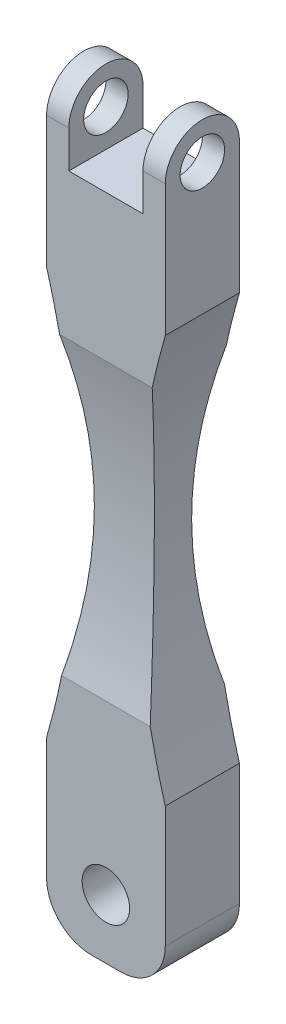
ISO-10303-21;
HEADER;
FILE_DESCRIPTION(('STEP AP214'),'2;1');
FILE_NAME('part.step','',(''),(''),'','','');
FILE_SCHEMA(('AUTOMOTIVE_DESIGN { 1 0 10303 214 1 1 1 1 }'));
ENDSEC;
DATA;
#1=APPLICATION_CONTEXT('core data for automotive mechanical design processes');
#2=APPLICATION_PROTOCOL_DEFINITION('international standard','automotive_design',2000,#1);
#3=PRODUCT_CONTEXT('',#1,'mechanical');
#4=PRODUCT('Part','Part','',(#3));
#5=PRODUCT_RELATED_PRODUCT_CATEGORY('part','',(#4));
#6=PRODUCT_DEFINITION_FORMATION('','',#4);
#7=PRODUCT_DEFINITION_CONTEXT('part definition',#1,'design');
#8=PRODUCT_DEFINITION('design','',#6,#7);
#9=PRODUCT_DEFINITION_SHAPE('','',#8);
#10=(LENGTH_UNIT() NAMED_UNIT(*) SI_UNIT(.MILLI.,.METRE.));
#11=(NAMED_UNIT(*) PLANE_ANGLE_UNIT() SI_UNIT($,.RADIAN.));
#12=(NAMED_UNIT(*) SI_UNIT($,.STERADIAN.) SOLID_ANGLE_UNIT());
#13=UNCERTAINTY_MEASURE_WITH_UNIT(LENGTH_MEASURE(1.E-05),#10,'distance_accuracy_value','');
#14=(GEOMETRIC_REPRESENTATION_CONTEXT(3) GLOBAL_UNCERTAINTY_ASSIGNED_CONTEXT((#13)) GLOBAL_UNIT_ASSIGNED_CONTEXT((#10,
#11,#12)) REPRESENTATION_CONTEXT('',''));
#15=CARTESIAN_POINT('',(0.,0.,0.));
#16=DIRECTION('',(0.,0.,1.));
#17=DIRECTION('',(1.,0.,0.));
#18=AXIS2_PLACEMENT_3D('',#15,#16,#17);
#19=CARTESIAN_POINT('',(4.,-22.,5.));
#20=DIRECTION('',(-1.,0.,0.));
#21=DIRECTION('',(0.,0.,1.));
#22=AXIS2_PLACEMENT_3D('',#19,#20,#21);
#23=PLANE('',#22);
#24=CARTESIAN_POINT('',(4.,22.5,2.5));
#25=DIRECTION('',(1.,0.,0.));
#26=DIRECTION('',(0.,0.,-1.));
#27=AXIS2_PLACEMENT_3D('',#24,#25,#26);
#28=CIRCLE('',#27,1.5);
#29=CARTESIAN_POINT('',(4.,22.5,1.));
#30=VERTEX_POINT('',#29);
#31=EDGE_CURVE('E253',#30,#30,#28,.T.);
#32=ORIENTED_EDGE('',*,*,#31,.F.);
#33=EDGE_LOOP('',(#32));
#34=FACE_BOUND('',#33,.T.);
#35=DIRECTION('',(0.,1.,0.));
#36=VECTOR('',#35,1.);
#37=CARTESIAN_POINT('',(4.,-22.,5.));
#38=LINE('',#37,#36);
#39=CARTESIAN_POINT('',(4.00000000002386,13.6424052445208,5.));
#40=VERTEX_POINT('',#39);
#41=CARTESIAN_POINT('',(4.,22.5,5.));
#42=VERTEX_POINT('',#41);
#43=EDGE_CURVE('E177',#40,#42,#38,.T.);
#44=ORIENTED_EDGE('',*,*,#43,.F.);
#45=DIRECTION('',(0.,0.,1.));
#46=VECTOR('',#45,1.);
#47=CARTESIAN_POINT('',(4.,13.6424052444381,-6.));
#48=LINE('',#47,#46);
#49=CARTESIAN_POINT('',(4.00000000002386,13.6424052445208,0.));
#50=VERTEX_POINT('',#49);
#51=EDGE_CURVE('E160',#40,#50,#48,.F.);
#52=ORIENTED_EDGE('',*,*,#51,.T.);
#53=DIRECTION('',(0.,1.,0.));
#54=VECTOR('',#53,1.);
#55=CARTESIAN_POINT('',(4.,-22.,0.));
#56=LINE('',#55,#54);
#57=CARTESIAN_POINT('',(4.,22.5,0.));
#58=VERTEX_POINT('',#57);
#59=EDGE_CURVE('E212',#50,#58,#56,.T.);
#60=ORIENTED_EDGE('',*,*,#59,.T.);
#61=CARTESIAN_POINT('',(4.,22.5,2.5));
#62=DIRECTION('',(-1.,0.,0.));
#63=DIRECTION('',(0.,0.,1.));
#64=AXIS2_PLACEMENT_3D('',#61,#62,#63);
#65=CIRCLE('',#64,2.5);
#66=EDGE_CURVE('E185',#58,#42,#65,.F.);
#67=ORIENTED_EDGE('',*,*,#66,.T.);
#68=EDGE_LOOP('',(#44,#52,#60,#67));
#69=FACE_BOUND('',#68,.T.);
#70=ADVANCED_FACE('F32',(#34,#69),#23,.F.);
#71=CARTESIAN_POINT('',(-4.,-22.,5.));
#72=DIRECTION('',(1.,0.,0.));
#73=DIRECTION('',(0.,0.,-1.));
#74=AXIS2_PLACEMENT_3D('',#71,#72,#73);
#75=PLANE('',#74);
#76=DIRECTION('',(0.,-1.,0.));
#77=VECTOR('',#76,1.);
#78=CARTESIAN_POINT('',(-4.,-22.,5.));
#79=LINE('',#78,#77);
#80=CARTESIAN_POINT('',(-3.9999999999869,-13.8172930789792,5.));
#81=VERTEX_POINT('',#80);
#82=CARTESIAN_POINT('',(-4.,-22.,5.));
#83=VERTEX_POINT('',#82);
#84=EDGE_CURVE('E191',#81,#83,#79,.T.);
#85=ORIENTED_EDGE('',*,*,#84,.F.);
#86=DIRECTION('',(0.,0.,1.));
#87=VECTOR('',#86,1.);
#88=CARTESIAN_POINT('',(-4.,-13.8172930790245,-6.));
#89=LINE('',#88,#87);
#90=CARTESIAN_POINT('',(-3.9999999999869,-13.8172930789792,0.));
#91=VERTEX_POINT('',#90);
#92=EDGE_CURVE('E304',#81,#91,#89,.F.);
#93=ORIENTED_EDGE('',*,*,#92,.T.);
#94=DIRECTION('',(0.,-1.,0.));
#95=VECTOR('',#94,1.);
#96=CARTESIAN_POINT('',(-4.,-22.,0.));
#97=LINE('',#96,#95);
#98=CARTESIAN_POINT('',(-4.,-22.,0.));
#99=VERTEX_POINT('',#98);
#100=EDGE_CURVE('E211',#91,#99,#97,.T.);
#101=ORIENTED_EDGE('',*,*,#100,.T.);
#102=DIRECTION('',(0.,0.,-1.));
#103=VECTOR('',#102,1.);
#104=CARTESIAN_POINT('',(-4.,-22.,5.));
#105=LINE('',#104,#103);
#106=EDGE_CURVE('E227',#83,#99,#105,.T.);
#107=ORIENTED_EDGE('',*,*,#106,.F.);
#108=EDGE_LOOP('',(#85,#93,#101,#107));
#109=FACE_BOUND('',#108,.T.);
#110=ADVANCED_FACE('F388',(#109),#75,.F.);
#111=CARTESIAN_POINT('',(-1.,-22.,0.));
#112=DIRECTION('',(0.,0.,-1.));
#113=DIRECTION('',(-1.,0.,0.));
#114=AXIS2_PLACEMENT_3D('',#111,#112,#113);
#115=PLANE('',#114);
#116=CARTESIAN_POINT('',(4.94369397898697,16.5966869294563,0.));
#117=CARTESIAN_POINT('',(-1.05582625880514,-0.525578169850888,0.));
#118=CARTESIAN_POINT('',(5.2463691205576,-17.605604068025,0.));
#119=B_SPLINE_CURVE_WITH_KNOTS('',2,(#116,#117,#118),.UNSPECIFIED.,.F.,.F.,(3,3),(0.,1.),.UNSPECIFIED.);
#120=CARTESIAN_POINT('',(3.12090452014877,10.1520270472682,2.16682683081004E-11));
#121=VERTEX_POINT('',#120);
#122=EDGE_CURVE('E166',#121,#50,#119,.F.);
#123=ORIENTED_EDGE('',*,*,#122,.F.);
#124=DIRECTION('',(1.,0.,0.));
#125=VECTOR('',#124,1.);
#126=CARTESIAN_POINT('',(-7.,10.1520270473549,0.));
#127=LINE('',#126,#125);
#128=CARTESIAN_POINT('',(-3.12090452014877,10.1520270473549,0.));
#129=VERTEX_POINT('',#128);
#130=EDGE_CURVE('E331',#129,#121,#127,.T.);
#131=ORIENTED_EDGE('',*,*,#130,.F.);
#132=CARTESIAN_POINT('',(-5.24636912055759,-17.605604068025,0.));
#133=CARTESIAN_POINT('',(1.05582625880514,-0.525578169850889,0.));
#134=CARTESIAN_POINT('',(-4.94369397898697,16.5966869294563,0.));
#135=B_SPLINE_CURVE_WITH_KNOTS('',2,(#132,#133,#134),.UNSPECIFIED.,.F.,.F.,(3,3),(0.,1.),.UNSPECIFIED.);
#136=CARTESIAN_POINT('',(-4.00000000002386,13.6424052445208,0.));
#137=VERTEX_POINT('',#136);
#138=EDGE_CURVE('E59',#137,#129,#135,.F.);
#139=ORIENTED_EDGE('',*,*,#138,.F.);
#140=CARTESIAN_POINT('',(-4.,22.5,0.));
#141=VERTEX_POINT('',#140);
#142=EDGE_CURVE('E213',#141,#137,#97,.T.);
#143=ORIENTED_EDGE('',*,*,#142,.F.);
#144=DIRECTION('',(1.,0.,0.));
#145=VECTOR('',#144,1.);
#146=CARTESIAN_POINT('',(-2.5,22.5,0.));
#147=LINE('',#146,#145);
#148=CARTESIAN_POINT('',(-2.5,22.5,0.));
#149=VERTEX_POINT('',#148);
#150=EDGE_CURVE('E235',#141,#149,#147,.T.);
#151=ORIENTED_EDGE('',*,*,#150,.T.);
#152=DIRECTION('',(0.,1.,0.));
#153=VECTOR('',#152,1.);
#154=CARTESIAN_POINT('',(-2.49999999999999,-22.,0.));
#155=LINE('',#154,#153);
#156=CARTESIAN_POINT('',(-2.5,20.,0.));
#157=VERTEX_POINT('',#156);
#158=EDGE_CURVE('E360',#157,#149,#155,.T.);
#159=ORIENTED_EDGE('',*,*,#158,.F.);
#160=DIRECTION('',(-1.,0.,0.));
#161=VECTOR('',#160,1.);
#162=CARTESIAN_POINT('',(-1.,20.,0.));
#163=LINE('',#162,#161);
#164=CARTESIAN_POINT('',(2.5,20.,0.));
#165=VERTEX_POINT('',#164);
#166=EDGE_CURVE('E230',#165,#157,#163,.T.);
#167=ORIENTED_EDGE('',*,*,#166,.F.);
#168=DIRECTION('',(0.,-1.,0.));
#169=VECTOR('',#168,1.);
#170=CARTESIAN_POINT('',(2.5,-22.,0.));
#171=LINE('',#170,#169);
#172=CARTESIAN_POINT('',(2.5,22.5,0.));
#173=VERTEX_POINT('',#172);
#174=EDGE_CURVE('E356',#173,#165,#171,.T.);
#175=ORIENTED_EDGE('',*,*,#174,.F.);
#176=DIRECTION('',(1.,0.,0.));
#177=VECTOR('',#176,1.);
#178=CARTESIAN_POINT('',(2.5,22.5,0.));
#179=LINE('',#178,#177);
#180=EDGE_CURVE('E242',#173,#58,#179,.T.);
#181=ORIENTED_EDGE('',*,*,#180,.T.);
#182=ORIENTED_EDGE('',*,*,#59,.F.);
#183=EDGE_LOOP('',(#123,#131,#139,#143,#151,#159,#167,#175,#181,#182));
#184=FACE_BOUND('',#183,.T.);
#185=ADVANCED_FACE('F395',(#184),#115,.T.);
#186=CARTESIAN_POINT('',(-1.,-22.,5.));
#187=DIRECTION('',(0.,0.,-1.));
#188=DIRECTION('',(-1.,0.,0.));
#189=AXIS2_PLACEMENT_3D('',#186,#187,#188);
#190=PLANE('',#189);
#191=CARTESIAN_POINT('',(0.,-21.,5.));
#192=DIRECTION('',(0.,0.,1.));
#193=DIRECTION('',(1.,0.,0.));
#194=AXIS2_PLACEMENT_3D('',#191,#192,#193);
#195=CIRCLE('',#194,1.6);
#196=CARTESIAN_POINT('',(1.6,-21.,5.));
#197=VERTEX_POINT('',#196);
#198=EDGE_CURVE('E362',#197,#197,#195,.T.);
#199=ORIENTED_EDGE('',*,*,#198,.F.);
#200=EDGE_LOOP('',(#199));
#201=FACE_BOUND('',#200,.T.);
#202=CARTESIAN_POINT('',(4.,-22.,5.));
#203=VERTEX_POINT('',#202);
#204=CARTESIAN_POINT('',(3.9999999999869,-13.8172930789791,5.));
#205=VERTEX_POINT('',#204);
#206=EDGE_CURVE('E187',#203,#205,#38,.T.);
#207=ORIENTED_EDGE('',*,*,#206,.T.);
#208=CARTESIAN_POINT('',(4.94369397898697,16.5966869294563,5.));
#209=CARTESIAN_POINT('',(-1.05582625880514,-0.525578169850888,5.));
#210=CARTESIAN_POINT('',(5.2463691205576,-17.605604068025,5.));
#211=B_SPLINE_CURVE_WITH_KNOTS('',2,(#208,#209,#210),.UNSPECIFIED.,.F.,.F.,(3,3),(0.,1.),.UNSPECIFIED.);
#212=CARTESIAN_POINT('',(2.98651646666856,-9.6892863226698,5.));
#213=VERTEX_POINT('',#212);
#214=EDGE_CURVE('E182',#213,#205,#211,.T.);
#215=ORIENTED_EDGE('',*,*,#214,.F.);
#216=DIRECTION('',(1.,0.,0.));
#217=VECTOR('',#216,1.);
#218=CARTESIAN_POINT('',(-7.,-9.68928632245198,5.));
#219=LINE('',#218,#217);
#220=CARTESIAN_POINT('',(-2.98651646666856,-9.6892863226698,5.));
#221=VERTEX_POINT('',#220);
#222=EDGE_CURVE('E336',#213,#221,#219,.F.);
#223=ORIENTED_EDGE('',*,*,#222,.T.);
#224=CARTESIAN_POINT('',(-5.24636912055759,-17.605604068025,5.));
#225=CARTESIAN_POINT('',(1.05582625880514,-0.525578169850889,5.));
#226=CARTESIAN_POINT('',(-4.94369397898697,16.5966869294563,5.));
#227=B_SPLINE_CURVE_WITH_KNOTS('',2,(#224,#225,#226),.UNSPECIFIED.,.F.,.F.,(3,3),(0.,1.),.UNSPECIFIED.);
#228=EDGE_CURVE('E284',#81,#221,#227,.T.);
#229=ORIENTED_EDGE('',*,*,#228,.F.);
#230=ORIENTED_EDGE('',*,*,#84,.T.);
#231=CARTESIAN_POINT('',(-1.,-22.,5.));
#232=DIRECTION('',(0.,0.,1.));
#233=DIRECTION('',(-1.,0.,0.));
#234=AXIS2_PLACEMENT_3D('',#231,#232,#233);
#235=CIRCLE('',#234,3.);
#236=CARTESIAN_POINT('',(-0.999999999999999,-25.,5.));
#237=VERTEX_POINT('',#236);
#238=EDGE_CURVE('E201',#83,#237,#235,.T.);
#239=ORIENTED_EDGE('',*,*,#238,.T.);
#240=DIRECTION('',(1.,0.,0.));
#241=VECTOR('',#240,1.);
#242=CARTESIAN_POINT('',(-1.,-25.,5.));
#243=LINE('',#242,#241);
#244=CARTESIAN_POINT('',(1.,-25.,5.));
#245=VERTEX_POINT('',#244);
#246=EDGE_CURVE('E203',#237,#245,#243,.T.);
#247=ORIENTED_EDGE('',*,*,#246,.T.);
#248=CARTESIAN_POINT('',(1.,-22.,5.));
#249=DIRECTION('',(0.,0.,1.));
#250=DIRECTION('',(1.,0.,0.));
#251=AXIS2_PLACEMENT_3D('',#248,#249,#250);
#252=CIRCLE('',#251,3.);
#253=EDGE_CURVE('E205',#245,#203,#252,.T.);
#254=ORIENTED_EDGE('',*,*,#253,.T.);
#255=EDGE_LOOP('',(#207,#215,#223,#229,#230,#239,#247,#254));
#256=FACE_BOUND('',#255,.T.);
#257=ADVANCED_FACE('F445',(#201,#256),#190,.F.);
#258=CARTESIAN_POINT('',(2.5,22.5,2.5));
#259=DIRECTION('',(-1.,0.,0.));
#260=DIRECTION('',(0.,0.,1.));
#261=AXIS2_PLACEMENT_3D('',#258,#259,#260);
#262=CYLINDRICAL_SURFACE('',#261,2.5);
#263=ORIENTED_EDGE('',*,*,#180,.F.);
#264=CARTESIAN_POINT('',(2.5,22.5,2.5));
#265=DIRECTION('',(1.,0.,0.));
#266=DIRECTION('',(0.,1.,0.));
#267=AXIS2_PLACEMENT_3D('',#264,#265,#266);
#268=CIRCLE('',#267,2.5);
#269=CARTESIAN_POINT('',(2.5,22.5,5.));
#270=VERTEX_POINT('',#269);
#271=EDGE_CURVE('E247',#270,#173,#268,.F.);
#272=ORIENTED_EDGE('',*,*,#271,.F.);
#273=DIRECTION('',(-1.,0.,0.));
#274=VECTOR('',#273,1.);
#275=CARTESIAN_POINT('',(-1.,22.5,5.));
#276=LINE('',#275,#274);
#277=EDGE_CURVE('E245',#42,#270,#276,.T.);
#278=ORIENTED_EDGE('',*,*,#277,.F.);
#279=ORIENTED_EDGE('',*,*,#66,.F.);
#280=EDGE_LOOP('',(#263,#272,#278,#279));
#281=FACE_BOUND('',#280,.T.);
#282=ADVANCED_FACE('F34',(#281),#262,.T.);
#283=CARTESIAN_POINT('',(-2.5,22.5,2.5));
#284=DIRECTION('',(-1.,0.,0.));
#285=DIRECTION('',(0.,0.,1.));
#286=AXIS2_PLACEMENT_3D('',#283,#284,#285);
#287=CYLINDRICAL_SURFACE('',#286,2.5);
#288=DIRECTION('',(-1.,0.,0.));
#289=VECTOR('',#288,1.);
#290=CARTESIAN_POINT('',(-1.,22.5,5.));
#291=LINE('',#290,#289);
#292=CARTESIAN_POINT('',(-2.5,22.5,5.));
#293=VERTEX_POINT('',#292);
#294=CARTESIAN_POINT('',(-4.,22.5,5.));
#295=VERTEX_POINT('',#294);
#296=EDGE_CURVE('E232',#293,#295,#291,.T.);
#297=ORIENTED_EDGE('',*,*,#296,.F.);
#298=CARTESIAN_POINT('',(-2.5,22.5,2.5));
#299=DIRECTION('',(-1.,0.,0.));
#300=DIRECTION('',(0.,-1.,0.));
#301=AXIS2_PLACEMENT_3D('',#298,#299,#300);
#302=CIRCLE('',#301,2.5);
#303=EDGE_CURVE('E238',#149,#293,#302,.F.);
#304=ORIENTED_EDGE('',*,*,#303,.F.);
#305=ORIENTED_EDGE('',*,*,#150,.F.);
#306=CARTESIAN_POINT('',(-4.,22.5,2.5));
#307=DIRECTION('',(1.,0.,0.));
#308=DIRECTION('',(0.,0.,-1.));
#309=AXIS2_PLACEMENT_3D('',#306,#307,#308);
#310=CIRCLE('',#309,2.5);
#311=EDGE_CURVE('E240',#295,#141,#310,.F.);
#312=ORIENTED_EDGE('',*,*,#311,.F.);
#313=EDGE_LOOP('',(#297,#304,#305,#312));
#314=FACE_BOUND('',#313,.T.);
#315=ADVANCED_FACE('F476',(#314),#287,.T.);
#316=DIRECTION('',(1.,0.,0.));
#317=VECTOR('',#316,1.);
#318=CARTESIAN_POINT('',(-7.,10.1520270473549,5.));
#319=LINE('',#318,#317);
#320=CARTESIAN_POINT('',(-3.12090452013813,10.1520270472187,5.));
#321=VERTEX_POINT('',#320);
#322=CARTESIAN_POINT('',(3.12090452013813,10.1520270472187,5.));
#323=VERTEX_POINT('',#322);
#324=EDGE_CURVE('E181',#321,#323,#319,.T.);
#325=ORIENTED_EDGE('',*,*,#324,.T.);
#326=EDGE_CURVE('E163',#40,#323,#211,.T.);
#327=ORIENTED_EDGE('',*,*,#326,.F.);
#328=ORIENTED_EDGE('',*,*,#43,.T.);
#329=ORIENTED_EDGE('',*,*,#277,.T.);
#330=DIRECTION('',(0.,1.,0.));
#331=VECTOR('',#330,1.);
#332=CARTESIAN_POINT('',(2.5,25.,5.));
#333=LINE('',#332,#331);
#334=CARTESIAN_POINT('',(2.5,20.,5.));
#335=VERTEX_POINT('',#334);
#336=EDGE_CURVE('E350',#335,#270,#333,.T.);
#337=ORIENTED_EDGE('',*,*,#336,.F.);
#338=DIRECTION('',(1.,0.,0.));
#339=VECTOR('',#338,1.);
#340=CARTESIAN_POINT('',(-2.5,20.,5.));
#341=LINE('',#340,#339);
#342=CARTESIAN_POINT('',(-2.5,20.,5.));
#343=VERTEX_POINT('',#342);
#344=EDGE_CURVE('E347',#343,#335,#341,.T.);
#345=ORIENTED_EDGE('',*,*,#344,.F.);
#346=DIRECTION('',(0.,-1.,0.));
#347=VECTOR('',#346,1.);
#348=CARTESIAN_POINT('',(-2.5,25.,5.));
#349=LINE('',#348,#347);
#350=EDGE_CURVE('E345',#293,#343,#349,.T.);
#351=ORIENTED_EDGE('',*,*,#350,.F.);
#352=ORIENTED_EDGE('',*,*,#296,.T.);
#353=CARTESIAN_POINT('',(-4.00000000002386,13.6424052445208,5.));
#354=VERTEX_POINT('',#353);
#355=EDGE_CURVE('E198',#295,#354,#79,.T.);
#356=ORIENTED_EDGE('',*,*,#355,.T.);
#357=EDGE_CURVE('E277',#321,#354,#227,.T.);
#358=ORIENTED_EDGE('',*,*,#357,.F.);
#359=EDGE_LOOP('',(#325,#327,#328,#329,#337,#345,#351,#352,#356,#358));
#360=FACE_BOUND('',#359,.T.);
#361=ADVANCED_FACE('F175',(#360),#190,.F.);
#362=CARTESIAN_POINT('',(4.94369397898697,16.5966869294563,0.));
#363=CARTESIAN_POINT('',(-1.05582625880514,-0.525578169850888,0.));
#364=CARTESIAN_POINT('',(5.2463691205576,-17.605604068025,0.));
#365=B_SPLINE_CURVE_WITH_KNOTS('',2,(#362,#363,#364),.UNSPECIFIED.,.F.,.F.,(3,3),(0.,1.),.UNSPECIFIED.);
#366=CARTESIAN_POINT('',(3.9999999999869,-13.8172930789791,0.));
#367=VERTEX_POINT('',#366);
#368=CARTESIAN_POINT('',(2.98651646660757,-9.68928632245195,0.));
#369=VERTEX_POINT('',#368);
#370=EDGE_CURVE('E52',#367,#369,#365,.F.);
#371=ORIENTED_EDGE('',*,*,#370,.F.);
#372=CARTESIAN_POINT('',(4.,-22.,0.));
#373=VERTEX_POINT('',#372);
#374=EDGE_CURVE('E208',#373,#367,#56,.T.);
#375=ORIENTED_EDGE('',*,*,#374,.F.);
#376=CARTESIAN_POINT('',(1.,-22.,0.));
#377=DIRECTION('',(0.,0.,1.));
#378=DIRECTION('',(1.,0.,0.));
#379=AXIS2_PLACEMENT_3D('',#376,#377,#378);
#380=CIRCLE('',#379,3.);
#381=CARTESIAN_POINT('',(1.,-25.,0.));
#382=VERTEX_POINT('',#381);
#383=EDGE_CURVE('E188',#382,#373,#380,.T.);
#384=ORIENTED_EDGE('',*,*,#383,.F.);
#385=DIRECTION('',(1.,0.,0.));
#386=VECTOR('',#385,1.);
#387=CARTESIAN_POINT('',(-1.,-25.,0.));
#388=LINE('',#387,#386);
#389=CARTESIAN_POINT('',(-0.999999999999999,-25.,0.));
#390=VERTEX_POINT('',#389);
#391=EDGE_CURVE('E192',#390,#382,#388,.T.);
#392=ORIENTED_EDGE('',*,*,#391,.F.);
#393=CARTESIAN_POINT('',(-1.,-22.,0.));
#394=DIRECTION('',(0.,0.,1.));
#395=DIRECTION('',(-1.,0.,0.));
#396=AXIS2_PLACEMENT_3D('',#393,#394,#395);
#397=CIRCLE('',#396,3.);
#398=EDGE_CURVE('E216',#99,#390,#397,.T.);
#399=ORIENTED_EDGE('',*,*,#398,.F.);
#400=ORIENTED_EDGE('',*,*,#100,.F.);
#401=CARTESIAN_POINT('',(-5.24636912055759,-17.605604068025,0.));
#402=CARTESIAN_POINT('',(1.05582625880514,-0.525578169850889,0.));
#403=CARTESIAN_POINT('',(-4.94369397898697,16.5966869294563,0.));
#404=B_SPLINE_CURVE_WITH_KNOTS('',2,(#401,#402,#403),.UNSPECIFIED.,.F.,.F.,(3,3),(0.,1.),.UNSPECIFIED.);
#405=CARTESIAN_POINT('',(-2.98651646660857,-9.68928632237282,1.97840062474836E-11));
#406=VERTEX_POINT('',#405);
#407=EDGE_CURVE('E285',#406,#91,#404,.F.);
#408=ORIENTED_EDGE('',*,*,#407,.F.);
#409=DIRECTION('',(1.,0.,0.));
#410=VECTOR('',#409,1.);
#411=CARTESIAN_POINT('',(-7.,-9.68928632245195,0.));
#412=LINE('',#411,#410);
#413=EDGE_CURVE('E312',#369,#406,#412,.F.);
#414=ORIENTED_EDGE('',*,*,#413,.F.);
#415=EDGE_LOOP('',(#371,#375,#384,#392,#399,#400,#408,#414));
#416=FACE_BOUND('',#415,.T.);
#417=CARTESIAN_POINT('',(0.,-21.,0.));
#418=DIRECTION('',(0.,0.,1.));
#419=DIRECTION('',(1.,0.,0.));
#420=AXIS2_PLACEMENT_3D('',#417,#418,#419);
#421=CIRCLE('',#420,1.6);
#422=CARTESIAN_POINT('',(1.6,-21.,0.));
#423=VERTEX_POINT('',#422);
#424=EDGE_CURVE('E196',#423,#423,#421,.T.);
#425=ORIENTED_EDGE('',*,*,#424,.T.);
#426=EDGE_LOOP('',(#425));
#427=FACE_BOUND('',#426,.T.);
#428=ADVANCED_FACE('F369',(#416,#427),#115,.T.);
#429=ORIENTED_EDGE('',*,*,#374,.T.);
#430=DIRECTION('',(0.,0.,1.));
#431=VECTOR('',#430,1.);
#432=CARTESIAN_POINT('',(4.,-13.8172930790245,-6.));
#433=LINE('',#432,#431);
#434=EDGE_CURVE('E171',#367,#205,#433,.T.);
#435=ORIENTED_EDGE('',*,*,#434,.T.);
#436=ORIENTED_EDGE('',*,*,#206,.F.);
#437=DIRECTION('',(0.,0.,-1.));
#438=VECTOR('',#437,1.);
#439=CARTESIAN_POINT('',(4.,-22.,5.));
#440=LINE('',#439,#438);
#441=EDGE_CURVE('E207',#203,#373,#440,.T.);
#442=ORIENTED_EDGE('',*,*,#441,.T.);
#443=EDGE_LOOP('',(#429,#435,#436,#442));
#444=FACE_BOUND('',#443,.T.);
#445=ADVANCED_FACE('F391',(#444),#23,.F.);
#446=CARTESIAN_POINT('',(-4.,22.5,2.5));
#447=DIRECTION('',(1.,0.,0.));
#448=DIRECTION('',(0.,0.,-1.));
#449=AXIS2_PLACEMENT_3D('',#446,#447,#448);
#450=CIRCLE('',#449,1.5);
#451=CARTESIAN_POINT('',(-4.,22.5,1.));
#452=VERTEX_POINT('',#451);
#453=EDGE_CURVE('E342',#452,#452,#450,.T.);
#454=ORIENTED_EDGE('',*,*,#453,.T.);
#455=EDGE_LOOP('',(#454));
#456=FACE_BOUND('',#455,.T.);
#457=ORIENTED_EDGE('',*,*,#142,.T.);
#458=DIRECTION('',(0.,0.,1.));
#459=VECTOR('',#458,1.);
#460=CARTESIAN_POINT('',(-4.,13.6424052444381,-6.));
#461=LINE('',#460,#459);
#462=EDGE_CURVE('E298',#137,#354,#461,.T.);
#463=ORIENTED_EDGE('',*,*,#462,.T.);
#464=ORIENTED_EDGE('',*,*,#355,.F.);
#465=ORIENTED_EDGE('',*,*,#311,.T.);
#466=EDGE_LOOP('',(#457,#463,#464,#465));
#467=FACE_BOUND('',#466,.T.);
#468=ADVANCED_FACE('F398',(#456,#467),#75,.F.);
#469=CARTESIAN_POINT('',(-1.,-22.,5.));
#470=DIRECTION('',(0.,0.,-1.));
#471=DIRECTION('',(-1.,0.,0.));
#472=AXIS2_PLACEMENT_3D('',#469,#470,#471);
#473=CYLINDRICAL_SURFACE('',#472,3.);
#474=ORIENTED_EDGE('',*,*,#398,.T.);
#475=DIRECTION('',(0.,0.,-1.));
#476=VECTOR('',#475,1.);
#477=CARTESIAN_POINT('',(-0.999999999999999,-25.,5.));
#478=LINE('',#477,#476);
#479=EDGE_CURVE('E224',#237,#390,#478,.T.);
#480=ORIENTED_EDGE('',*,*,#479,.F.);
#481=ORIENTED_EDGE('',*,*,#238,.F.);
#482=ORIENTED_EDGE('',*,*,#106,.T.);
#483=EDGE_LOOP('',(#474,#480,#481,#482));
#484=FACE_BOUND('',#483,.T.);
#485=ADVANCED_FACE('F406',(#484),#473,.T.);
#486=CARTESIAN_POINT('',(-1.,-25.,5.));
#487=DIRECTION('',(0.,1.,0.));
#488=DIRECTION('',(0.,0.,1.));
#489=AXIS2_PLACEMENT_3D('',#486,#487,#488);
#490=PLANE('',#489);
#491=ORIENTED_EDGE('',*,*,#391,.T.);
#492=DIRECTION('',(0.,0.,-1.));
#493=VECTOR('',#492,1.);
#494=CARTESIAN_POINT('',(1.,-25.,5.));
#495=LINE('',#494,#493);
#496=EDGE_CURVE('E221',#245,#382,#495,.T.);
#497=ORIENTED_EDGE('',*,*,#496,.F.);
#498=ORIENTED_EDGE('',*,*,#246,.F.);
#499=ORIENTED_EDGE('',*,*,#479,.T.);
#500=EDGE_LOOP('',(#491,#497,#498,#499));
#501=FACE_BOUND('',#500,.T.);
#502=ADVANCED_FACE('F383',(#501),#490,.F.);
#503=CARTESIAN_POINT('',(1.,-22.,5.));
#504=DIRECTION('',(0.,0.,-1.));
#505=DIRECTION('',(-1.,0.,0.));
#506=AXIS2_PLACEMENT_3D('',#503,#504,#505);
#507=CYLINDRICAL_SURFACE('',#506,3.);
#508=ORIENTED_EDGE('',*,*,#383,.T.);
#509=ORIENTED_EDGE('',*,*,#441,.F.);
#510=ORIENTED_EDGE('',*,*,#253,.F.);
#511=ORIENTED_EDGE('',*,*,#496,.T.);
#512=EDGE_LOOP('',(#508,#509,#510,#511));
#513=FACE_BOUND('',#512,.T.);
#514=ADVANCED_FACE('F374',(#513),#507,.T.);
#515=CARTESIAN_POINT('',(0.,-21.,5.));
#516=DIRECTION('',(0.,0.,-1.));
#517=DIRECTION('',(-1.,0.,0.));
#518=AXIS2_PLACEMENT_3D('',#515,#516,#517);
#519=CYLINDRICAL_SURFACE('',#518,1.6);
#520=ORIENTED_EDGE('',*,*,#198,.T.);
#521=EDGE_LOOP('',(#520));
#522=FACE_BOUND('',#521,.T.);
#523=ORIENTED_EDGE('',*,*,#424,.F.);
#524=EDGE_LOOP('',(#523));
#525=FACE_BOUND('',#524,.T.);
#526=ADVANCED_FACE('F371',(#522,#525),#519,.F.);
#527=CARTESIAN_POINT('',(-2.5,25.,-6.));
#528=DIRECTION('',(-1.,0.,0.));
#529=DIRECTION('',(0.,-1.,0.));
#530=AXIS2_PLACEMENT_3D('',#527,#528,#529);
#531=PLANE('',#530);
#532=CARTESIAN_POINT('',(-2.5,22.5,2.5));
#533=DIRECTION('',(-1.,0.,0.));
#534=DIRECTION('',(0.,-1.,0.));
#535=AXIS2_PLACEMENT_3D('',#532,#533,#534);
#536=CIRCLE('',#535,1.5);
#537=CARTESIAN_POINT('',(-2.5,21.,2.5));
#538=VERTEX_POINT('',#537);
#539=EDGE_CURVE('E252',#538,#538,#536,.T.);
#540=ORIENTED_EDGE('',*,*,#539,.T.);
#541=EDGE_LOOP('',(#540));
#542=FACE_BOUND('',#541,.T.);
#543=ORIENTED_EDGE('',*,*,#158,.T.);
#544=ORIENTED_EDGE('',*,*,#303,.T.);
#545=ORIENTED_EDGE('',*,*,#350,.T.);
#546=DIRECTION('',(0.,0.,1.));
#547=VECTOR('',#546,1.);
#548=CARTESIAN_POINT('',(-2.5,20.,-6.));
#549=LINE('',#548,#547);
#550=EDGE_CURVE('E353',#157,#343,#549,.T.);
#551=ORIENTED_EDGE('',*,*,#550,.F.);
#552=EDGE_LOOP('',(#543,#544,#545,#551));
#553=FACE_BOUND('',#552,.T.);
#554=ADVANCED_FACE('F373',(#542,#553),#531,.F.);
#555=CARTESIAN_POINT('',(2.5,25.,-6.));
#556=DIRECTION('',(1.,0.,0.));
#557=DIRECTION('',(0.,1.,0.));
#558=AXIS2_PLACEMENT_3D('',#555,#556,#557);
#559=PLANE('',#558);
#560=CARTESIAN_POINT('',(2.5,22.5,2.5));
#561=DIRECTION('',(1.,0.,0.));
#562=DIRECTION('',(0.,1.,0.));
#563=AXIS2_PLACEMENT_3D('',#560,#561,#562);
#564=CIRCLE('',#563,1.5);
#565=CARTESIAN_POINT('',(2.5,24.,2.5));
#566=VERTEX_POINT('',#565);
#567=EDGE_CURVE('E250',#566,#566,#564,.T.);
#568=ORIENTED_EDGE('',*,*,#567,.T.);
#569=EDGE_LOOP('',(#568));
#570=FACE_BOUND('',#569,.T.);
#571=ORIENTED_EDGE('',*,*,#336,.T.);
#572=ORIENTED_EDGE('',*,*,#271,.T.);
#573=ORIENTED_EDGE('',*,*,#174,.T.);
#574=DIRECTION('',(0.,0.,1.));
#575=VECTOR('',#574,1.);
#576=CARTESIAN_POINT('',(2.5,20.,-6.));
#577=LINE('',#576,#575);
#578=EDGE_CURVE('E354',#165,#335,#577,.T.);
#579=ORIENTED_EDGE('',*,*,#578,.T.);
#580=EDGE_LOOP('',(#571,#572,#573,#579));
#581=FACE_BOUND('',#580,.T.);
#582=ADVANCED_FACE('F380',(#570,#581),#559,.F.);
#583=CARTESIAN_POINT('',(-2.5,20.,-6.));
#584=DIRECTION('',(0.,-1.,0.));
#585=DIRECTION('',(0.,0.,-1.));
#586=AXIS2_PLACEMENT_3D('',#583,#584,#585);
#587=PLANE('',#586);
#588=ORIENTED_EDGE('',*,*,#166,.T.);
#589=ORIENTED_EDGE('',*,*,#550,.T.);
#590=ORIENTED_EDGE('',*,*,#344,.T.);
#591=ORIENTED_EDGE('',*,*,#578,.F.);
#592=EDGE_LOOP('',(#588,#589,#590,#591));
#593=FACE_BOUND('',#592,.T.);
#594=ADVANCED_FACE('F519',(#593),#587,.F.);
#595=CARTESIAN_POINT('',(-7.,22.5,2.5));
#596=DIRECTION('',(1.,0.,0.));
#597=DIRECTION('',(0.,0.,-1.));
#598=AXIS2_PLACEMENT_3D('',#595,#596,#597);
#599=CYLINDRICAL_SURFACE('',#598,1.5);
#600=ORIENTED_EDGE('',*,*,#31,.T.);
#601=EDGE_LOOP('',(#600));
#602=FACE_BOUND('',#601,.T.);
#603=ORIENTED_EDGE('',*,*,#567,.F.);
#604=EDGE_LOOP('',(#603));
#605=FACE_BOUND('',#604,.T.);
#606=ADVANCED_FACE('F509',(#602,#605),#599,.F.);
#607=ORIENTED_EDGE('',*,*,#539,.F.);
#608=EDGE_LOOP('',(#607));
#609=FACE_BOUND('',#608,.T.);
#610=ORIENTED_EDGE('',*,*,#453,.F.);
#611=EDGE_LOOP('',(#610));
#612=FACE_BOUND('',#611,.T.);
#613=ADVANCED_FACE('F322',(#609,#612),#599,.F.);
#614=CARTESIAN_POINT('',(-7.,-12.6614308533972,5.85444770231344));
#615=CARTESIAN_POINT('',(-7.,0.354662237617996,1.62465182259075));
#616=CARTESIAN_POINT('',(-7.,13.3817472444784,5.93818782481465));
#617=B_SPLINE_CURVE_WITH_KNOTS('',2,(#614,#615,#616),.UNSPECIFIED.,.F.,.F.,(3,3),(0.,1.),.UNSPECIFIED.);
#618=DIRECTION('',(1.,0.,0.));
#619=VECTOR('',#618,1.);
#620=SURFACE_OF_LINEAR_EXTRUSION('',#617,#619);
#621=ORIENTED_EDGE('',*,*,#222,.F.);
#622=CARTESIAN_POINT('',(2.98651646660758,-9.68928632236791,4.99999999997898));
#623=CARTESIAN_POINT('',(2.91274651422579,-9.32411832727747,4.9086992604698));
#624=CARTESIAN_POINT('',(2.84281162914471,-8.95701851810355,4.82197129447609));
#625=CARTESIAN_POINT('',(2.71090113355974,-8.21924636020431,4.65801071625352));
#626=CARTESIAN_POINT('',(2.6489263480444,-7.84857364545434,4.58077908826503));
#627=CARTESIAN_POINT('',(2.53324107740273,-7.10402565007766,4.43618065638396));
#628=CARTESIAN_POINT('',(2.47953052307881,-6.73015039629395,4.3688137698927));
#629=CARTESIAN_POINT('',(2.38055267510154,-5.97892872584344,4.24415823772889));
#630=CARTESIAN_POINT('',(2.33530026819242,-5.6015773930417,4.18688737141755));
#631=CARTESIAN_POINT('',(2.25359137117781,-4.84447128380694,4.08285626716613));
#632=CARTESIAN_POINT('',(2.21713496647019,-4.46471648407608,4.03609613127201));
#633=CARTESIAN_POINT('',(2.15321231403425,-3.70323851984978,3.95332409568675));
#634=CARTESIAN_POINT('',(2.12574730375969,-3.32151509175596,3.91731367550099));
#635=CARTESIAN_POINT('',(2.06861941001479,-2.36690860406506,3.84109805295675));
#636=CARTESIAN_POINT('',(2.0446230800435,-1.79311943974696,3.80767121030642));
#637=CARTESIAN_POINT('',(2.01744515218346,-0.643987566171057,3.76573586225109));
#638=CARTESIAN_POINT('',(2.01426968493544,-0.0686444492396366,3.7572346965444));
#639=CARTESIAN_POINT('',(2.0288022122443,1.08167642972817,3.76525385468934));
#640=CARTESIAN_POINT('',(2.04651271750179,1.65665413952517,3.78177718680118));
#641=CARTESIAN_POINT('',(2.10258574020975,2.80383023878304,3.8395928899991));
#642=CARTESIAN_POINT('',(2.14092980943695,3.37603065097125,3.88086313892451));
#643=CARTESIAN_POINT('',(2.23778586914543,4.51635545040447,3.9876082296553));
#644=CARTESIAN_POINT('',(2.29629520401415,5.08448036431004,4.05307988440138));
#645=CARTESIAN_POINT('',(2.43277503298086,6.21494268743571,4.20739964198149));
#646=CARTESIAN_POINT('',(2.51073673779115,6.77728259137246,4.29623718823521));
#647=CARTESIAN_POINT('',(2.63509311293961,7.57372816173834,4.4387706563544));
#648=CARTESIAN_POINT('',(2.67387644687473,7.81072002370441,4.48331691386388));
#649=CARTESIAN_POINT('',(2.7547240512853,8.28332222742037,4.5763549615933));
#650=CARTESIAN_POINT('',(2.7967876720422,8.51893283286261,4.62484597056745));
#651=CARTESIAN_POINT('',(2.88404812068118,8.98831402948282,4.72560052106518));
#652=CARTESIAN_POINT('',(2.92923932679952,9.22208712216911,4.77785730033818));
#653=CARTESIAN_POINT('',(3.02274831255924,9.6881778504167,4.88613259066877));
#654=CARTESIAN_POINT('',(3.07106664649923,9.9204952198953,4.94215176869663));
#655=CARTESIAN_POINT('',(3.12090452014877,10.1520270472682,4.99999999997833));
#656=B_SPLINE_CURVE_WITH_KNOTS('',3,(#622,#623,#624,#625,#626,#627,#628,#629,#630,#631,#632,
#633,#634,#635,#636,#637,#638,#639,#640,#641,#642,#643,#644,#645,#646,#647,#648,#649,#650,#651,
#652,#653,#654,#655),.UNSPECIFIED.,.F.,.F.,(4,2,2,2,2,2,2,2,2,2,2,2,2,2,2,2,4),(0.,
1.1506764104804,2.30147198155027,3.4522579163171,4.6050505997488,5.75785447486485,
6.91081693966315,8.63564264808281,10.3609762034731,12.086517182176,13.8105179324405,
15.5342917315786,17.2572880730432,17.9899682279312,18.7225036294084,19.4537548986087,
20.1851361425448),.UNSPECIFIED.);
#657=EDGE_CURVE('E170',#213,#323,#656,.T.);
#658=ORIENTED_EDGE('',*,*,#657,.T.);
#659=ORIENTED_EDGE('',*,*,#324,.F.);
#660=CARTESIAN_POINT('',(-3.12090451944524,10.1520270439997,4.99999999916172));
#661=CARTESIAN_POINT('',(-3.04251022836839,9.78784793400914,4.90900537171646));
#662=CARTESIAN_POINT('',(-2.96787884178816,9.42171307502145,4.82254021406014));
#663=CARTESIAN_POINT('',(-2.82643895936332,8.68580568958994,4.65902147030052));
#664=CARTESIAN_POINT('',(-2.75963134481939,8.31603275841503,4.58196894443129));
#665=CARTESIAN_POINT('',(-2.63415422411658,7.57320726399042,4.43764914687608));
#666=CARTESIAN_POINT('',(-2.57548467202142,7.20015471926554,4.37038181995625));
#667=CARTESIAN_POINT('',(-2.46645294600905,6.45039822813349,4.24583703162394));
#668=CARTESIAN_POINT('',(-2.41610752688158,6.07368849510431,4.18857970534377));
#669=CARTESIAN_POINT('',(-2.32411729151296,5.31776212864056,4.08451547514204));
#670=CARTESIAN_POINT('',(-2.28247254531689,4.9385454750493,4.03770865535245));
#671=CARTESIAN_POINT('',(-2.20809437540116,4.17802819950689,3.95479307626904));
#672=CARTESIAN_POINT('',(-2.17536218852083,3.79672729579622,3.91868580174199));
#673=CARTESIAN_POINT('',(-2.10502254221951,2.84315160052637,3.84219111406779));
#674=CARTESIAN_POINT('',(-2.07303997217094,2.26989463542246,3.80855272787259));
#675=CARTESIAN_POINT('',(-2.0298155124324,1.12153032547653,3.76614205778102));
#676=CARTESIAN_POINT('',(-2.01857965714187,0.54642249099907,3.75737700815742));
#677=CARTESIAN_POINT('',(-2.01699256709881,-0.603733459108692,3.76486471453864));
#678=CARTESIAN_POINT('',(-2.02664385132407,-1.1787815591711,3.78112048797298));
#679=CARTESIAN_POINT('',(-2.06667918516155,-2.32632252928231,3.83844242596324));
#680=CARTESIAN_POINT('',(-2.09704210242917,-2.89881740571201,3.87948329707657));
#681=CARTESIAN_POINT('',(-2.17807660072045,-4.04000553443571,3.98585226818005));
#682=CARTESIAN_POINT('',(-2.22874552272052,-4.60869927457057,4.05117718815004));
#683=CARTESIAN_POINT('',(-2.34974697966587,-5.74053522484313,4.20532260622331));
#684=CARTESIAN_POINT('',(-2.42007048557491,-6.30367986147336,4.29413231474256));
#685=CARTESIAN_POINT('',(-2.53377307351186,-7.10179686291986,4.4367989865603));
#686=CARTESIAN_POINT('',(-2.56944423066069,-7.33957310514802,4.4814530299677));
#687=CARTESIAN_POINT('',(-2.64412639998898,-7.81377168276569,4.57474725292678));
#688=CARTESIAN_POINT('',(-2.68313674718417,-8.05019427776866,4.62338663873383));
#689=CARTESIAN_POINT('',(-2.76435991203633,-8.52124043010975,4.72448308986946));
#690=CARTESIAN_POINT('',(-2.80656725687171,-8.75586633729172,4.77693362503439));
#691=CARTESIAN_POINT('',(-2.8941708912543,-9.22368296160683,4.88563885049521));
#692=CARTESIAN_POINT('',(-2.93956775008659,-9.4568734144112,4.94189421983526));
#693=CARTESIAN_POINT('',(-2.98651646610362,-9.68928631987311,4.99999999935526));
#694=B_SPLINE_CURVE_WITH_KNOTS('',3,(#660,#661,#662,#663,#664,#665,#666,#667,#668,#669,#670,
#671,#672,#673,#674,#675,#676,#677,#678,#679,#680,#681,#682,#683,#684,#685,#686,#687,#688,#689,
#690,#691,#692,#693),.UNSPECIFIED.,.F.,.F.,(4,2,2,2,2,2,2,2,2,2,2,2,2,2,2,2,4),(0.,
1.15039075558077,2.30091097134502,3.45142469259452,4.60422669277923,5.75703797327981,
6.91000915358378,8.63445205185182,10.3593964434499,12.0845488740061,13.8079437370849,
15.5311129993574,17.2534919596457,17.9870935822354,18.7205494498409,19.4527769471712,
20.1851354708524),.UNSPECIFIED.);
#695=EDGE_CURVE('E307',#321,#221,#694,.T.);
#696=ORIENTED_EDGE('',*,*,#695,.T.);
#697=EDGE_LOOP('',(#621,#658,#659,#696));
#698=FACE_BOUND('',#697,.T.);
#699=ADVANCED_FACE('F317',(#698),#620,.F.);
#700=CARTESIAN_POINT('',(-7.,13.3817472444784,-0.938187824814654));
#701=CARTESIAN_POINT('',(-7.,0.354662237617997,3.37534817740925));
#702=CARTESIAN_POINT('',(-7.,-12.6614308533972,-0.854447702313451));
#703=B_SPLINE_CURVE_WITH_KNOTS('',2,(#700,#701,#702),.UNSPECIFIED.,.F.,.F.,(3,3),(0.,1.),.UNSPECIFIED.);
#704=DIRECTION('',(1.,0.,0.));
#705=VECTOR('',#704,1.);
#706=SURFACE_OF_LINEAR_EXTRUSION('',#703,#705);
#707=ORIENTED_EDGE('',*,*,#130,.T.);
#708=CARTESIAN_POINT('',(3.12090452014877,10.1520270472682,2.16682683081004E-11));
#709=CARTESIAN_POINT('',(3.0425102290495,9.78784793728945,0.090994627493915));
#710=CARTESIAN_POINT('',(2.96787884244636,9.42171307831323,0.177459785177815));
#711=CARTESIAN_POINT('',(2.82643895997474,8.68580569290378,0.340978528993723));
#712=CARTESIAN_POINT('',(2.75963134540694,8.31603276173944,0.418031054891653));
#713=CARTESIAN_POINT('',(2.63415422465552,7.57320726733492,0.562350852505313));
#714=CARTESIAN_POINT('',(2.57548467253562,7.20015472261957,0.629618179454885));
#715=CARTESIAN_POINT('',(2.46645294647296,6.45039823150573,0.754162967847651));
#716=CARTESIAN_POINT('',(2.41610752731992,6.07368849848524,0.81142029415854));
#717=CARTESIAN_POINT('',(2.32411729189944,5.31776213203757,0.915484524422559));
#718=CARTESIAN_POINT('',(2.28247254567708,4.93854547845369,0.962291344243723));
#719=CARTESIAN_POINT('',(2.20809437570815,4.17802820292462,1.04520692339101));
#720=CARTESIAN_POINT('',(2.17536218880092,3.79672729921989,1.08131419795036));
#721=CARTESIAN_POINT('',(2.10502254243185,2.84315160396305,1.15780888570585));
#722=CARTESIAN_POINT('',(2.07303997234212,2.26989463886526,1.19144727195041));
#723=CARTESIAN_POINT('',(2.0298155125207,1.12153032892798,1.23385794214138));
#724=CARTESIAN_POINT('',(2.01857965718842,0.546422494453046,1.24262299181501));
#725=CARTESIAN_POINT('',(2.0169925670618,-0.60373345565331,1.2351352855339));
#726=CARTESIAN_POINT('',(2.02664385124524,-1.17878155571684,1.21887951214964));
#727=CARTESIAN_POINT('',(2.06667918499964,-2.32632252583501,1.16155757425882));
#728=CARTESIAN_POINT('',(2.09704210222603,-2.89881740227053,1.12051670319483));
#729=CARTESIAN_POINT('',(2.17807660043591,-4.04000553100936,1.01414773218869));
#730=CARTESIAN_POINT('',(2.22874552239582,-4.60869927115351,0.948822812266726));
#731=CARTESIAN_POINT('',(2.34974697926232,-5.74053522144785,0.794677394287658));
#732=CARTESIAN_POINT('',(2.4200704851327,-6.30367985809057,0.705867685814591));
#733=CARTESIAN_POINT('',(2.53377307308623,-7.10179686005102,0.563201013972763));
#734=CARTESIAN_POINT('',(2.56944423029665,-7.33957310277695,0.518546970487563));
#735=CARTESIAN_POINT('',(2.64412639976214,-7.8137716813848,0.425252747356098));
#736=CARTESIAN_POINT('',(2.68313674703296,-8.0501942768802,0.376613361454478));
#737=CARTESIAN_POINT('',(2.76435991204977,-8.52124043019913,0.275516910113717));
#738=CARTESIAN_POINT('',(2.80656725697414,-8.75586633786653,0.223066374838272));
#739=CARTESIAN_POINT('',(2.8941708915478,-9.22368296314636,0.11436114914081));
#740=CARTESIAN_POINT('',(2.93956775048218,-9.45687341643002,0.0581057796746344));
#741=CARTESIAN_POINT('',(2.98651646660757,-9.68928632236787,2.10207827706921E-11));
#742=B_SPLINE_CURVE_WITH_KNOTS('',3,(#708,#709,#710,#711,#712,#713,#714,#715,#716,#717,#718,
#719,#720,#721,#722,#723,#724,#725,#726,#727,#728,#729,#730,#731,#732,#733,#734,#735,#736,#737,
#738,#739,#740,#741),.UNSPECIFIED.,.F.,.F.,(4,2,2,2,2,2,2,2,2,2,2,2,2,2,2,2,4),(0.,
1.15039075557995,2.30091097134344,3.45142469259218,4.60422669277515,5.75703797327398,
6.91000915357625,8.63445205184157,10.3593964434368,12.08454887399,13.8079437370691,
15.5311129993421,17.2534919596315,17.9870935837423,18.7205494528686,19.4527769517157,
20.1851354769141),.UNSPECIFIED.);
#743=EDGE_CURVE('E11',#121,#369,#742,.T.);
#744=ORIENTED_EDGE('',*,*,#743,.T.);
#745=ORIENTED_EDGE('',*,*,#413,.T.);
#746=CARTESIAN_POINT('',(-2.98651646660857,-9.68928632237282,1.97840062474836E-11));
#747=CARTESIAN_POINT('',(-2.91274651422675,-9.3241183272824,0.0913007395290059));
#748=CARTESIAN_POINT('',(-2.84281162914563,-8.95701851810849,0.178028705522761));
#749=CARTESIAN_POINT('',(-2.71090113356059,-8.21924636020929,0.341989283745414));
#750=CARTESIAN_POINT('',(-2.64892634804521,-7.84857364545934,0.419220911733949));
#751=CARTESIAN_POINT('',(-2.53324107740347,-7.10402565008269,0.563819343615105));
#752=CARTESIAN_POINT('',(-2.47953052307951,-6.73015039629899,0.631186230106413));
#753=CARTESIAN_POINT('',(-2.38055267510217,-5.97892872584851,0.755841762270314));
#754=CARTESIAN_POINT('',(-2.33530026819301,-5.60157739304678,0.813112628581693));
#755=CARTESIAN_POINT('',(-2.25359137117832,-4.84447128381205,0.917143732833215));
#756=CARTESIAN_POINT('',(-2.21713496647066,-4.4647164840812,0.963903868727379));
#757=CARTESIAN_POINT('',(-2.15321231403464,-3.70323851985492,1.04667590431273));
#758=CARTESIAN_POINT('',(-2.12574730376004,-3.3215150917611,1.08268632449854));
#759=CARTESIAN_POINT('',(-2.06861941001504,-2.36690860407022,1.1589019470429));
#760=CARTESIAN_POINT('',(-2.04462308004368,-1.79311943975213,1.19232878969331));
#761=CARTESIAN_POINT('',(-2.01744515218351,-0.643987566176243,1.23426413774879));
#762=CARTESIAN_POINT('',(-2.01426968493543,-0.0686444492448291,1.24276530345556));
#763=CARTESIAN_POINT('',(-2.02880221224417,1.08167642972298,1.23474614531076));
#764=CARTESIAN_POINT('',(-2.0465127175016,1.65665413951997,1.218222813199));
#765=CARTESIAN_POINT('',(-2.10258574020943,2.80383023877785,1.16040711000123));
#766=CARTESIAN_POINT('',(-2.14092980943657,3.37603065096606,1.11913686107589));
#767=CARTESIAN_POINT('',(-2.23778586914493,4.5163554503993,1.01239177034525));
#768=CARTESIAN_POINT('',(-2.29629520401359,5.08448036430488,0.94692011559925));
#769=CARTESIAN_POINT('',(-2.43277503298018,6.21494268743058,0.792600358019282));
#770=CARTESIAN_POINT('',(-2.51073673779041,6.77728259136735,0.703762811765626));
#771=CARTESIAN_POINT('',(-2.63509311293886,7.57372816173368,0.561229343646465));
#772=CARTESIAN_POINT('',(-2.67387644687402,7.81072002370018,0.516683086136924));
#773=CARTESIAN_POINT('',(-2.75472405128471,8.283322227417,0.423645038407387));
#774=CARTESIAN_POINT('',(-2.79678767204167,8.51893283285967,0.375154029433162));
#775=CARTESIAN_POINT('',(-2.88404812068078,8.98831402948072,0.274399478935276));
#776=CARTESIAN_POINT('',(-2.92923932679919,9.22208712216744,0.2221426996622));
#777=CARTESIAN_POINT('',(-3.02274831255907,9.68817785041587,0.113867409331428));
#778=CARTESIAN_POINT('',(-3.07106664649914,9.92049521989489,0.0578482313034656));
#779=CARTESIAN_POINT('',(-3.12090452014877,10.1520270472682,2.16672383160366E-11));
#780=B_SPLINE_CURVE_WITH_KNOTS('',3,(#746,#747,#748,#749,#750,#751,#752,#753,#754,#755,#756,
#757,#758,#759,#760,#761,#762,#763,#764,#765,#766,#767,#768,#769,#770,#771,#772,#773,#774,#775,
#776,#777,#778,#779),.UNSPECIFIED.,.F.,.F.,(4,2,2,2,2,2,2,2,2,2,2,2,2,2,2,2,4),(0.,
1.1506764104804,2.30147198155026,3.45225791631709,4.60505059974879,5.75785447486483,
6.91081693966314,8.63564264808279,10.3609762034731,12.086517182176,13.8105179324405,
15.5342917315786,17.2572880730431,17.9899682279324,18.722503629411,19.4537548986125,
20.1851361425499),.UNSPECIFIED.);
#781=EDGE_CURVE('E45',#406,#129,#780,.T.);
#782=ORIENTED_EDGE('',*,*,#781,.T.);
#783=EDGE_LOOP('',(#707,#744,#745,#782));
#784=FACE_BOUND('',#783,.T.);
#785=ADVANCED_FACE('F258',(#784),#706,.F.);
#786=CARTESIAN_POINT('',(-5.24636912055759,-17.605604068025,-6.));
#787=CARTESIAN_POINT('',(1.05582625880514,-0.525578169850889,-6.));
#788=CARTESIAN_POINT('',(-4.94369397898697,16.5966869294563,-6.));
#789=B_SPLINE_CURVE_WITH_KNOTS('',2,(#786,#787,#788),.UNSPECIFIED.,.F.,.F.,(3,3),(0.,1.),.UNSPECIFIED.);
#790=DIRECTION('',(0.,0.,1.));
#791=VECTOR('',#790,1.);
#792=SURFACE_OF_LINEAR_EXTRUSION('',#789,#791);
#793=ORIENTED_EDGE('',*,*,#357,.T.);
#794=ORIENTED_EDGE('',*,*,#462,.F.);
#795=ORIENTED_EDGE('',*,*,#138,.T.);
#796=ORIENTED_EDGE('',*,*,#781,.F.);
#797=ORIENTED_EDGE('',*,*,#407,.T.);
#798=ORIENTED_EDGE('',*,*,#92,.F.);
#799=ORIENTED_EDGE('',*,*,#228,.T.);
#800=ORIENTED_EDGE('',*,*,#695,.F.);
#801=EDGE_LOOP('',(#793,#794,#795,#796,#797,#798,#799,#800));
#802=FACE_BOUND('',#801,.T.);
#803=ADVANCED_FACE('F262',(#802),#792,.F.);
#804=CARTESIAN_POINT('',(4.94369397898697,16.5966869294563,-6.));
#805=CARTESIAN_POINT('',(-1.05582625880514,-0.525578169850888,-6.));
#806=CARTESIAN_POINT('',(5.2463691205576,-17.605604068025,-6.));
#807=B_SPLINE_CURVE_WITH_KNOTS('',2,(#804,#805,#806),.UNSPECIFIED.,.F.,.F.,(3,3),(0.,1.),.UNSPECIFIED.);
#808=DIRECTION('',(0.,0.,1.));
#809=VECTOR('',#808,1.);
#810=SURFACE_OF_LINEAR_EXTRUSION('',#807,#809);
#811=ORIENTED_EDGE('',*,*,#214,.T.);
#812=ORIENTED_EDGE('',*,*,#434,.F.);
#813=ORIENTED_EDGE('',*,*,#370,.T.);
#814=ORIENTED_EDGE('',*,*,#743,.F.);
#815=ORIENTED_EDGE('',*,*,#122,.T.);
#816=ORIENTED_EDGE('',*,*,#51,.F.);
#817=ORIENTED_EDGE('',*,*,#326,.T.);
#818=ORIENTED_EDGE('',*,*,#657,.F.);
#819=EDGE_LOOP('',(#811,#812,#813,#814,#815,#816,#817,#818));
#820=FACE_BOUND('',#819,.T.);
#821=ADVANCED_FACE('F162',(#820),#810,.F.);
#822=CLOSED_SHELL('',(#70,#110,#185,#257,#282,#315,#361,#428,#445,#468,#485,#502,#514,#526,#554,
#582,#594,#606,#613,#699,#785,#803,#821));
#823=MANIFOLD_SOLID_BREP('B2',#822);
#824=ADVANCED_BREP_SHAPE_REPRESENTATION('',(#18,#823),#14);
#825=SHAPE_DEFINITION_REPRESENTATION(#9,#824);
ENDSEC;
END-ISO-10303-21;
